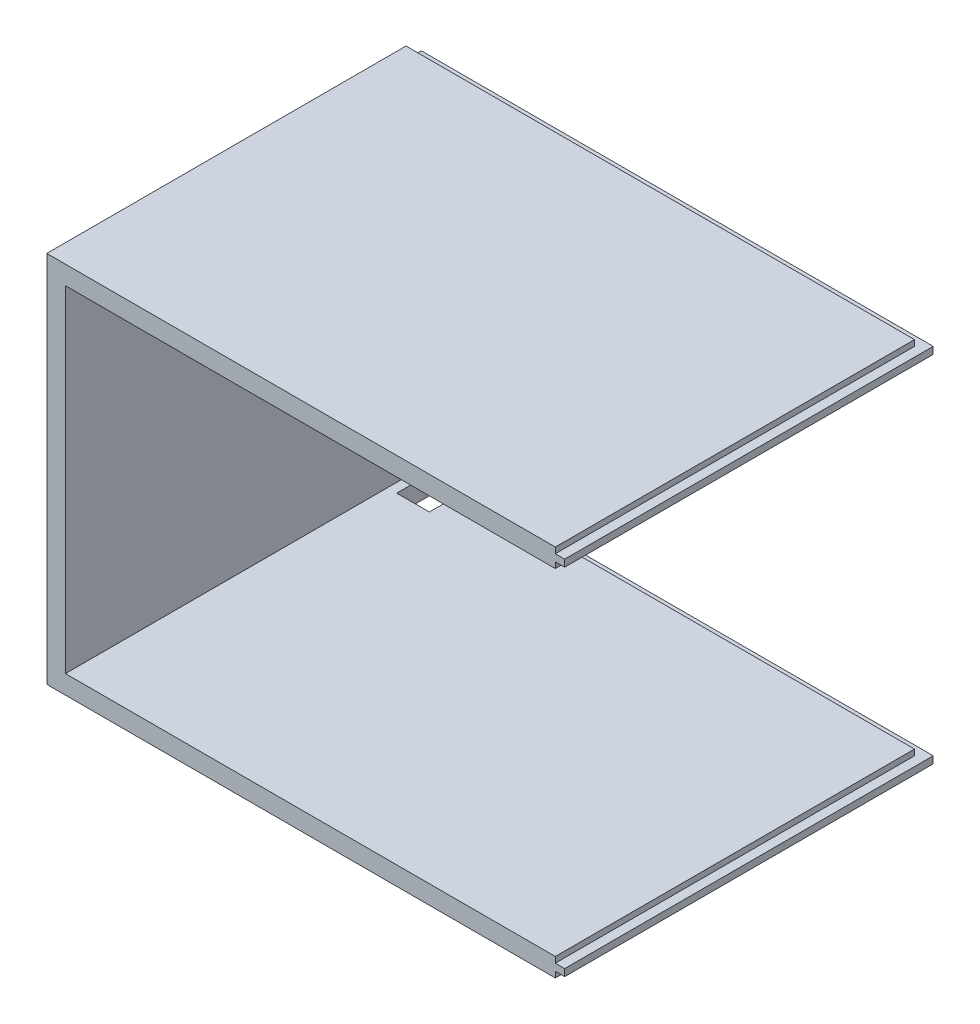
ISO-10303-21;
HEADER;
FILE_DESCRIPTION(('STEP AP214'),'2;1');
FILE_NAME('part.step','',(''),(''),'','','');
FILE_SCHEMA(('AUTOMOTIVE_DESIGN { 1 0 10303 214 1 1 1 1 }'));
ENDSEC;
DATA;
#1=APPLICATION_CONTEXT('core data for automotive mechanical design processes');
#2=APPLICATION_PROTOCOL_DEFINITION('international standard','automotive_design',2000,#1);
#3=PRODUCT_CONTEXT('',#1,'mechanical');
#4=PRODUCT('Part','Part','',(#3));
#5=PRODUCT_RELATED_PRODUCT_CATEGORY('part','',(#4));
#6=PRODUCT_DEFINITION_FORMATION('','',#4);
#7=PRODUCT_DEFINITION_CONTEXT('part definition',#1,'design');
#8=PRODUCT_DEFINITION('design','',#6,#7);
#9=PRODUCT_DEFINITION_SHAPE('','',#8);
#10=(LENGTH_UNIT() NAMED_UNIT(*) SI_UNIT(.MILLI.,.METRE.));
#11=(NAMED_UNIT(*) PLANE_ANGLE_UNIT() SI_UNIT($,.RADIAN.));
#12=(NAMED_UNIT(*) SI_UNIT($,.STERADIAN.) SOLID_ANGLE_UNIT());
#13=UNCERTAINTY_MEASURE_WITH_UNIT(LENGTH_MEASURE(1.E-05),#10,'distance_accuracy_value','');
#14=(GEOMETRIC_REPRESENTATION_CONTEXT(3) GLOBAL_UNCERTAINTY_ASSIGNED_CONTEXT((#13)) GLOBAL_UNIT_ASSIGNED_CONTEXT((#10,
#11,#12)) REPRESENTATION_CONTEXT('',''));
#15=CARTESIAN_POINT('',(0.,0.,0.));
#16=DIRECTION('',(0.,0.,1.));
#17=DIRECTION('',(1.,0.,0.));
#18=AXIS2_PLACEMENT_3D('',#15,#16,#17);
#19=CARTESIAN_POINT('',(0.,0.,-77.));
#20=DIRECTION('',(0.,0.,1.));
#21=DIRECTION('',(1.,0.,0.));
#22=AXIS2_PLACEMENT_3D('',#19,#20,#21);
#23=PLANE('',#22);
#24=DIRECTION('',(1.,0.,0.));
#25=VECTOR('',#24,1.);
#26=CARTESIAN_POINT('',(0.,-40.,-77.));
#27=LINE('',#26,#25);
#28=CARTESIAN_POINT('',(-42.5,-40.,-77.));
#29=VERTEX_POINT('',#28);
#30=CARTESIAN_POINT('',(53.5,-40.,-77.));
#31=VERTEX_POINT('',#30);
#32=EDGE_CURVE('E416',#29,#31,#27,.T.);
#33=ORIENTED_EDGE('',*,*,#32,.F.);
#34=DIRECTION('',(0.,1.,0.));
#35=VECTOR('',#34,1.);
#36=CARTESIAN_POINT('',(-42.5,0.,-77.));
#37=LINE('',#36,#35);
#38=CARTESIAN_POINT('',(-42.5,-38.75,-77.));
#39=VERTEX_POINT('',#38);
#40=EDGE_CURVE('E250',#29,#39,#37,.T.);
#41=ORIENTED_EDGE('',*,*,#40,.T.);
#42=DIRECTION('',(-1.,0.,0.));
#43=VECTOR('',#42,1.);
#44=CARTESIAN_POINT('',(0.,-38.75,-77.));
#45=LINE('',#44,#43);
#46=CARTESIAN_POINT('',(53.5,-38.75,-77.));
#47=VERTEX_POINT('',#46);
#48=EDGE_CURVE('E319',#47,#39,#45,.T.);
#49=ORIENTED_EDGE('',*,*,#48,.F.);
#50=DIRECTION('',(0.,1.,0.));
#51=VECTOR('',#50,1.);
#52=CARTESIAN_POINT('',(53.5,-38.75,-77.));
#53=LINE('',#52,#51);
#54=EDGE_CURVE('E361',#31,#47,#53,.T.);
#55=ORIENTED_EDGE('',*,*,#54,.F.);
#56=EDGE_LOOP('',(#33,#41,#49,#55));
#57=FACE_BOUND('',#56,.T.);
#58=ADVANCED_FACE('F41',(#57),#23,.F.);
#59=DIRECTION('',(-1.,0.,0.));
#60=VECTOR('',#59,1.);
#61=CARTESIAN_POINT('',(0.,-37.25,-77.));
#62=LINE('',#61,#60);
#63=CARTESIAN_POINT('',(53.5,-37.25,-77.));
#64=VERTEX_POINT('',#63);
#65=CARTESIAN_POINT('',(-42.5,-37.25,-77.));
#66=VERTEX_POINT('',#65);
#67=EDGE_CURVE('E258',#64,#66,#62,.T.);
#68=ORIENTED_EDGE('',*,*,#67,.T.);
#69=DIRECTION('',(0.,1.,0.));
#70=VECTOR('',#69,1.);
#71=CARTESIAN_POINT('',(-42.5,0.,-77.));
#72=LINE('',#71,#70);
#73=CARTESIAN_POINT('',(-42.5,-36.,-77.));
#74=VERTEX_POINT('',#73);
#75=EDGE_CURVE('E279',#66,#74,#72,.T.);
#76=ORIENTED_EDGE('',*,*,#75,.T.);
#77=DIRECTION('',(1.,0.,0.));
#78=VECTOR('',#77,1.);
#79=CARTESIAN_POINT('',(0.,-36.,-77.));
#80=LINE('',#79,#78);
#81=CARTESIAN_POINT('',(53.5,-36.,-77.));
#82=VERTEX_POINT('',#81);
#83=EDGE_CURVE('E407',#74,#82,#80,.T.);
#84=ORIENTED_EDGE('',*,*,#83,.T.);
#85=DIRECTION('',(0.,1.,0.));
#86=VECTOR('',#85,1.);
#87=CARTESIAN_POINT('',(53.5,-36.,-77.));
#88=LINE('',#87,#86);
#89=EDGE_CURVE('E368',#64,#82,#88,.T.);
#90=ORIENTED_EDGE('',*,*,#89,.F.);
#91=EDGE_LOOP('',(#68,#76,#84,#90));
#92=FACE_BOUND('',#91,.T.);
#93=ADVANCED_FACE('F465',(#92),#23,.F.);
#94=CARTESIAN_POINT('',(55.5,-37.25,0.));
#95=DIRECTION('',(0.,-1.,0.));
#96=DIRECTION('',(0.,0.,-1.));
#97=AXIS2_PLACEMENT_3D('',#94,#95,#96);
#98=PLANE('',#97);
#99=DIRECTION('',(-1.,0.,0.));
#100=VECTOR('',#99,1.);
#101=CARTESIAN_POINT('',(0.,-37.25,-79.));
#102=LINE('',#101,#100);
#103=CARTESIAN_POINT('',(55.5,-37.25,-79.));
#104=VERTEX_POINT('',#103);
#105=CARTESIAN_POINT('',(-42.5,-37.25,-79.));
#106=VERTEX_POINT('',#105);
#107=EDGE_CURVE('E300',#104,#106,#102,.T.);
#108=ORIENTED_EDGE('',*,*,#107,.T.);
#109=DIRECTION('',(0.,0.,1.));
#110=VECTOR('',#109,1.);
#111=CARTESIAN_POINT('',(-42.5,-37.25,0.));
#112=LINE('',#111,#110);
#113=EDGE_CURVE('E274',#106,#66,#112,.T.);
#114=ORIENTED_EDGE('',*,*,#113,.T.);
#115=ORIENTED_EDGE('',*,*,#67,.F.);
#116=DIRECTION('',(0.,0.,-1.));
#117=VECTOR('',#116,1.);
#118=CARTESIAN_POINT('',(53.5,-37.25,0.));
#119=LINE('',#118,#117);
#120=CARTESIAN_POINT('',(53.5,-37.25,0.));
#121=VERTEX_POINT('',#120);
#122=EDGE_CURVE('E395',#121,#64,#119,.T.);
#123=ORIENTED_EDGE('',*,*,#122,.F.);
#124=DIRECTION('',(-1.,0.,0.));
#125=VECTOR('',#124,1.);
#126=CARTESIAN_POINT('',(55.5,-37.25,0.));
#127=LINE('',#126,#125);
#128=CARTESIAN_POINT('',(55.5,-37.25,0.));
#129=VERTEX_POINT('',#128);
#130=EDGE_CURVE('E386',#129,#121,#127,.T.);
#131=ORIENTED_EDGE('',*,*,#130,.F.);
#132=DIRECTION('',(0.,0.,-1.));
#133=VECTOR('',#132,1.);
#134=CARTESIAN_POINT('',(55.5,-37.25,0.));
#135=LINE('',#134,#133);
#136=EDGE_CURVE('E396',#129,#104,#135,.T.);
#137=ORIENTED_EDGE('',*,*,#136,.T.);
#138=EDGE_LOOP('',(#108,#114,#115,#123,#131,#137));
#139=FACE_BOUND('',#138,.T.);
#140=ADVANCED_FACE('F462',(#139),#98,.F.);
#141=CARTESIAN_POINT('',(55.5,-38.75,0.));
#142=DIRECTION('',(0.,1.,0.));
#143=DIRECTION('',(0.,0.,1.));
#144=AXIS2_PLACEMENT_3D('',#141,#142,#143);
#145=PLANE('',#144);
#146=ORIENTED_EDGE('',*,*,#48,.T.);
#147=DIRECTION('',(0.,0.,-1.));
#148=VECTOR('',#147,1.);
#149=CARTESIAN_POINT('',(-42.5,-38.75,0.));
#150=LINE('',#149,#148);
#151=CARTESIAN_POINT('',(-42.5,-38.75,-79.));
#152=VERTEX_POINT('',#151);
#153=EDGE_CURVE('E271',#39,#152,#150,.T.);
#154=ORIENTED_EDGE('',*,*,#153,.T.);
#155=DIRECTION('',(-1.,0.,0.));
#156=VECTOR('',#155,1.);
#157=CARTESIAN_POINT('',(0.,-38.75,-79.));
#158=LINE('',#157,#156);
#159=CARTESIAN_POINT('',(55.5,-38.75,-79.));
#160=VERTEX_POINT('',#159);
#161=EDGE_CURVE('E307',#160,#152,#158,.T.);
#162=ORIENTED_EDGE('',*,*,#161,.F.);
#163=DIRECTION('',(0.,0.,-1.));
#164=VECTOR('',#163,1.);
#165=CARTESIAN_POINT('',(55.5,-38.75,0.));
#166=LINE('',#165,#164);
#167=CARTESIAN_POINT('',(55.5,-38.75,0.));
#168=VERTEX_POINT('',#167);
#169=EDGE_CURVE('E360',#168,#160,#166,.T.);
#170=ORIENTED_EDGE('',*,*,#169,.F.);
#171=DIRECTION('',(1.,0.,0.));
#172=VECTOR('',#171,1.);
#173=CARTESIAN_POINT('',(55.5,-38.75,0.));
#174=LINE('',#173,#172);
#175=CARTESIAN_POINT('',(53.5,-38.75,0.));
#176=VERTEX_POINT('',#175);
#177=EDGE_CURVE('E357',#176,#168,#174,.T.);
#178=ORIENTED_EDGE('',*,*,#177,.F.);
#179=DIRECTION('',(0.,0.,-1.));
#180=VECTOR('',#179,1.);
#181=CARTESIAN_POINT('',(53.5,-38.75,0.));
#182=LINE('',#181,#180);
#183=EDGE_CURVE('E354',#176,#47,#182,.T.);
#184=ORIENTED_EDGE('',*,*,#183,.T.);
#185=EDGE_LOOP('',(#146,#154,#162,#170,#178,#184));
#186=FACE_BOUND('',#185,.T.);
#187=ADVANCED_FACE('F474',(#186),#145,.F.);
#188=CARTESIAN_POINT('',(0.,0.,-79.));
#189=DIRECTION('',(0.,0.,-1.));
#190=DIRECTION('',(-1.,0.,0.));
#191=AXIS2_PLACEMENT_3D('',#188,#189,#190);
#192=PLANE('',#191);
#193=CARTESIAN_POINT('',(-49.5,-37.25,-79.));
#194=VERTEX_POINT('',#193);
#195=CARTESIAN_POINT('',(-52.75,-37.25,-79.));
#196=VERTEX_POINT('',#195);
#197=EDGE_CURVE('E298',#194,#196,#102,.T.);
#198=ORIENTED_EDGE('',*,*,#197,.F.);
#199=DIRECTION('',(0.,-1.,0.));
#200=VECTOR('',#199,1.);
#201=CARTESIAN_POINT('',(-49.5,-30.,-79.));
#202=LINE('',#201,#200);
#203=CARTESIAN_POINT('',(-49.5,-38.75,-79.));
#204=VERTEX_POINT('',#203);
#205=EDGE_CURVE('E11',#194,#204,#202,.T.);
#206=ORIENTED_EDGE('',*,*,#205,.T.);
#207=CARTESIAN_POINT('',(-54.25,-38.75,-79.));
#208=VERTEX_POINT('',#207);
#209=EDGE_CURVE('E308',#204,#208,#158,.T.);
#210=ORIENTED_EDGE('',*,*,#209,.T.);
#211=DIRECTION('',(0.,-1.,0.));
#212=VECTOR('',#211,1.);
#213=CARTESIAN_POINT('',(-54.25,0.,-79.));
#214=LINE('',#213,#212);
#215=CARTESIAN_POINT('',(-54.25,38.75,-79.));
#216=VERTEX_POINT('',#215);
#217=EDGE_CURVE('E283',#216,#208,#214,.T.);
#218=ORIENTED_EDGE('',*,*,#217,.F.);
#219=DIRECTION('',(-1.,0.,0.));
#220=VECTOR('',#219,1.);
#221=CARTESIAN_POINT('',(0.,38.75,-79.));
#222=LINE('',#221,#220);
#223=CARTESIAN_POINT('',(55.5,38.75,-79.));
#224=VERTEX_POINT('',#223);
#225=EDGE_CURVE('E290',#224,#216,#222,.T.);
#226=ORIENTED_EDGE('',*,*,#225,.F.);
#227=DIRECTION('',(0.,-1.,0.));
#228=VECTOR('',#227,1.);
#229=CARTESIAN_POINT('',(55.5,0.,-79.));
#230=LINE('',#229,#228);
#231=CARTESIAN_POINT('',(55.5,37.25,-79.));
#232=VERTEX_POINT('',#231);
#233=EDGE_CURVE('E292',#224,#232,#230,.T.);
#234=ORIENTED_EDGE('',*,*,#233,.T.);
#235=DIRECTION('',(-1.,0.,0.));
#236=VECTOR('',#235,1.);
#237=CARTESIAN_POINT('',(-1.29236898960271E-13,37.2499999999998,-79.));
#238=LINE('',#237,#236);
#239=CARTESIAN_POINT('',(-52.75,37.2499999999998,-79.));
#240=VERTEX_POINT('',#239);
#241=EDGE_CURVE('E294',#232,#240,#238,.T.);
#242=ORIENTED_EDGE('',*,*,#241,.T.);
#243=DIRECTION('',(0.,-1.,0.));
#244=VECTOR('',#243,1.);
#245=CARTESIAN_POINT('',(-52.75,0.,-79.));
#246=LINE('',#245,#244);
#247=EDGE_CURVE('E296',#240,#196,#246,.T.);
#248=ORIENTED_EDGE('',*,*,#247,.T.);
#249=EDGE_LOOP('',(#198,#206,#210,#218,#226,#234,#242,#248));
#250=FACE_BOUND('',#249,.T.);
#251=ADVANCED_FACE('F515',(#250),#192,.T.);
#252=CARTESIAN_POINT('',(-49.5,-38.75,-77.));
#253=VERTEX_POINT('',#252);
#254=CARTESIAN_POINT('',(-54.25,-38.75,-77.));
#255=VERTEX_POINT('',#254);
#256=EDGE_CURVE('E312',#253,#255,#45,.T.);
#257=ORIENTED_EDGE('',*,*,#256,.F.);
#258=DIRECTION('',(0.,-1.,0.));
#259=VECTOR('',#258,1.);
#260=CARTESIAN_POINT('',(-49.5,0.,-77.));
#261=LINE('',#260,#259);
#262=CARTESIAN_POINT('',(-49.5,-40.,-77.));
#263=VERTEX_POINT('',#262);
#264=EDGE_CURVE('E59',#253,#263,#261,.T.);
#265=ORIENTED_EDGE('',*,*,#264,.T.);
#266=CARTESIAN_POINT('',(-55.5,-40.,-77.));
#267=VERTEX_POINT('',#266);
#268=EDGE_CURVE('E420',#267,#263,#27,.T.);
#269=ORIENTED_EDGE('',*,*,#268,.F.);
#270=DIRECTION('',(0.,-1.,0.));
#271=VECTOR('',#270,1.);
#272=CARTESIAN_POINT('',(-55.5,0.,-77.));
#273=LINE('',#272,#271);
#274=CARTESIAN_POINT('',(-55.5,40.,-77.));
#275=VERTEX_POINT('',#274);
#276=EDGE_CURVE('E413',#275,#267,#273,.T.);
#277=ORIENTED_EDGE('',*,*,#276,.F.);
#278=DIRECTION('',(1.,0.,0.));
#279=VECTOR('',#278,1.);
#280=CARTESIAN_POINT('',(0.,40.,-77.));
#281=LINE('',#280,#279);
#282=CARTESIAN_POINT('',(53.5,40.,-77.));
#283=VERTEX_POINT('',#282);
#284=EDGE_CURVE('E415',#275,#283,#281,.T.);
#285=ORIENTED_EDGE('',*,*,#284,.T.);
#286=DIRECTION('',(0.,1.,0.));
#287=VECTOR('',#286,1.);
#288=CARTESIAN_POINT('',(53.5,40.,-77.));
#289=LINE('',#288,#287);
#290=CARTESIAN_POINT('',(53.5,38.75,-77.));
#291=VERTEX_POINT('',#290);
#292=EDGE_CURVE('E362',#291,#283,#289,.T.);
#293=ORIENTED_EDGE('',*,*,#292,.F.);
#294=DIRECTION('',(-1.,0.,0.));
#295=VECTOR('',#294,1.);
#296=CARTESIAN_POINT('',(0.,38.75,-77.));
#297=LINE('',#296,#295);
#298=CARTESIAN_POINT('',(-54.25,38.75,-77.));
#299=VERTEX_POINT('',#298);
#300=EDGE_CURVE('E315',#291,#299,#297,.T.);
#301=ORIENTED_EDGE('',*,*,#300,.T.);
#302=DIRECTION('',(0.,-1.,0.));
#303=VECTOR('',#302,1.);
#304=CARTESIAN_POINT('',(-54.25,0.,-77.));
#305=LINE('',#304,#303);
#306=EDGE_CURVE('E67',#299,#255,#305,.T.);
#307=ORIENTED_EDGE('',*,*,#306,.T.);
#308=EDGE_LOOP('',(#257,#265,#269,#277,#285,#293,#301,#307));
#309=FACE_BOUND('',#308,.T.);
#310=ADVANCED_FACE('F489',(#309),#23,.F.);
#311=CARTESIAN_POINT('',(55.5,0.,-77.));
#312=DIRECTION('',(-1.,0.,0.));
#313=DIRECTION('',(0.,-1.,0.));
#314=AXIS2_PLACEMENT_3D('',#311,#312,#313);
#315=PLANE('',#314);
#316=DIRECTION('',(0.,-1.,0.));
#317=VECTOR('',#316,1.);
#318=CARTESIAN_POINT('',(55.5,0.,0.));
#319=LINE('',#318,#317);
#320=EDGE_CURVE('E427',#129,#168,#319,.T.);
#321=ORIENTED_EDGE('',*,*,#320,.T.);
#322=ORIENTED_EDGE('',*,*,#169,.T.);
#323=DIRECTION('',(0.,-1.,0.));
#324=VECTOR('',#323,1.);
#325=CARTESIAN_POINT('',(55.5,0.,-79.));
#326=LINE('',#325,#324);
#327=EDGE_CURVE('E304',#104,#160,#326,.T.);
#328=ORIENTED_EDGE('',*,*,#327,.F.);
#329=ORIENTED_EDGE('',*,*,#136,.F.);
#330=EDGE_LOOP('',(#321,#322,#328,#329));
#331=FACE_BOUND('',#330,.T.);
#332=ADVANCED_FACE('F471',(#331),#315,.F.);
#333=DIRECTION('',(0.,0.,-1.));
#334=VECTOR('',#333,1.);
#335=CARTESIAN_POINT('',(55.5,38.75,0.));
#336=LINE('',#335,#334);
#337=CARTESIAN_POINT('',(55.5,38.75,0.));
#338=VERTEX_POINT('',#337);
#339=EDGE_CURVE('E376',#338,#224,#336,.T.);
#340=ORIENTED_EDGE('',*,*,#339,.F.);
#341=CARTESIAN_POINT('',(55.5,37.25,0.));
#342=VERTEX_POINT('',#341);
#343=EDGE_CURVE('E428',#338,#342,#319,.T.);
#344=ORIENTED_EDGE('',*,*,#343,.T.);
#345=DIRECTION('',(0.,0.,-1.));
#346=VECTOR('',#345,1.);
#347=CARTESIAN_POINT('',(55.5,37.25,0.));
#348=LINE('',#347,#346);
#349=EDGE_CURVE('E342',#342,#232,#348,.T.);
#350=ORIENTED_EDGE('',*,*,#349,.T.);
#351=ORIENTED_EDGE('',*,*,#233,.F.);
#352=EDGE_LOOP('',(#340,#344,#350,#351));
#353=FACE_BOUND('',#352,.T.);
#354=ADVANCED_FACE('F507',(#353),#315,.F.);
#355=CARTESIAN_POINT('',(-51.5,-36.,-77.));
#356=VERTEX_POINT('',#355);
#357=CARTESIAN_POINT('',(-49.5,-36.,-77.));
#358=VERTEX_POINT('',#357);
#359=EDGE_CURVE('E401',#356,#358,#80,.T.);
#360=ORIENTED_EDGE('',*,*,#359,.T.);
#361=DIRECTION('',(0.,-1.,0.));
#362=VECTOR('',#361,1.);
#363=CARTESIAN_POINT('',(-49.5,0.,-77.));
#364=LINE('',#363,#362);
#365=CARTESIAN_POINT('',(-49.5,-37.25,-77.));
#366=VERTEX_POINT('',#365);
#367=EDGE_CURVE('E264',#358,#366,#364,.T.);
#368=ORIENTED_EDGE('',*,*,#367,.T.);
#369=CARTESIAN_POINT('',(-52.75,-37.25,-77.));
#370=VERTEX_POINT('',#369);
#371=EDGE_CURVE('E317',#366,#370,#62,.T.);
#372=ORIENTED_EDGE('',*,*,#371,.T.);
#373=DIRECTION('',(0.,-1.,0.));
#374=VECTOR('',#373,1.);
#375=CARTESIAN_POINT('',(-52.75,0.,-77.));
#376=LINE('',#375,#374);
#377=CARTESIAN_POINT('',(-52.75,37.2499999999998,-77.));
#378=VERTEX_POINT('',#377);
#379=EDGE_CURVE('E289',#378,#370,#376,.T.);
#380=ORIENTED_EDGE('',*,*,#379,.F.);
#381=DIRECTION('',(-1.,0.,0.));
#382=VECTOR('',#381,1.);
#383=CARTESIAN_POINT('',(-1.29236898960271E-13,37.2499999999998,-77.));
#384=LINE('',#383,#382);
#385=CARTESIAN_POINT('',(53.5,37.25,-77.));
#386=VERTEX_POINT('',#385);
#387=EDGE_CURVE('E320',#386,#378,#384,.T.);
#388=ORIENTED_EDGE('',*,*,#387,.F.);
#389=DIRECTION('',(0.,1.,0.));
#390=VECTOR('',#389,1.);
#391=CARTESIAN_POINT('',(53.5,37.25,-77.));
#392=LINE('',#391,#390);
#393=CARTESIAN_POINT('',(53.5,36.,-77.));
#394=VERTEX_POINT('',#393);
#395=EDGE_CURVE('E341',#394,#386,#392,.T.);
#396=ORIENTED_EDGE('',*,*,#395,.F.);
#397=DIRECTION('',(1.,0.,0.));
#398=VECTOR('',#397,1.);
#399=CARTESIAN_POINT('',(0.,36.,-77.));
#400=LINE('',#399,#398);
#401=CARTESIAN_POINT('',(-51.5,36.,-77.));
#402=VERTEX_POINT('',#401);
#403=EDGE_CURVE('E408',#402,#394,#400,.T.);
#404=ORIENTED_EDGE('',*,*,#403,.F.);
#405=DIRECTION('',(0.,-1.,0.));
#406=VECTOR('',#405,1.);
#407=CARTESIAN_POINT('',(-51.5,0.,-77.));
#408=LINE('',#407,#406);
#409=EDGE_CURVE('E406',#402,#356,#408,.T.);
#410=ORIENTED_EDGE('',*,*,#409,.T.);
#411=EDGE_LOOP('',(#360,#368,#372,#380,#388,#396,#404,#410));
#412=FACE_BOUND('',#411,.T.);
#413=ADVANCED_FACE('F528',(#412),#23,.F.);
#414=CARTESIAN_POINT('',(0.,0.,0.));
#415=DIRECTION('',(0.,0.,1.));
#416=DIRECTION('',(1.,0.,0.));
#417=AXIS2_PLACEMENT_3D('',#414,#415,#416);
#418=PLANE('',#417);
#419=DIRECTION('',(1.,0.,0.));
#420=VECTOR('',#419,1.);
#421=CARTESIAN_POINT('',(0.,-40.,0.));
#422=LINE('',#421,#420);
#423=CARTESIAN_POINT('',(-55.5,-40.,0.));
#424=VERTEX_POINT('',#423);
#425=CARTESIAN_POINT('',(53.5,-40.,0.));
#426=VERTEX_POINT('',#425);
#427=EDGE_CURVE('E435',#424,#426,#422,.T.);
#428=ORIENTED_EDGE('',*,*,#427,.T.);
#429=DIRECTION('',(0.,1.,0.));
#430=VECTOR('',#429,1.);
#431=CARTESIAN_POINT('',(53.5,-38.75,0.));
#432=LINE('',#431,#430);
#433=EDGE_CURVE('E370',#426,#176,#432,.T.);
#434=ORIENTED_EDGE('',*,*,#433,.T.);
#435=ORIENTED_EDGE('',*,*,#177,.T.);
#436=ORIENTED_EDGE('',*,*,#320,.F.);
#437=ORIENTED_EDGE('',*,*,#130,.T.);
#438=DIRECTION('',(0.,1.,0.));
#439=VECTOR('',#438,1.);
#440=CARTESIAN_POINT('',(53.5,-36.,0.));
#441=LINE('',#440,#439);
#442=CARTESIAN_POINT('',(53.5,-36.,0.));
#443=VERTEX_POINT('',#442);
#444=EDGE_CURVE('E387',#121,#443,#441,.T.);
#445=ORIENTED_EDGE('',*,*,#444,.T.);
#446=DIRECTION('',(1.,0.,0.));
#447=VECTOR('',#446,1.);
#448=CARTESIAN_POINT('',(0.,-36.,0.));
#449=LINE('',#448,#447);
#450=CARTESIAN_POINT('',(-51.5,-36.,0.));
#451=VERTEX_POINT('',#450);
#452=EDGE_CURVE('E399',#451,#443,#449,.T.);
#453=ORIENTED_EDGE('',*,*,#452,.F.);
#454=DIRECTION('',(0.,-1.,0.));
#455=VECTOR('',#454,1.);
#456=CARTESIAN_POINT('',(-51.5,0.,0.));
#457=LINE('',#456,#455);
#458=CARTESIAN_POINT('',(-51.5,36.,0.));
#459=VERTEX_POINT('',#458);
#460=EDGE_CURVE('E421',#459,#451,#457,.T.);
#461=ORIENTED_EDGE('',*,*,#460,.F.);
#462=DIRECTION('',(1.,0.,0.));
#463=VECTOR('',#462,1.);
#464=CARTESIAN_POINT('',(0.,36.,0.));
#465=LINE('',#464,#463);
#466=CARTESIAN_POINT('',(53.5,36.,0.));
#467=VERTEX_POINT('',#466);
#468=EDGE_CURVE('E422',#459,#467,#465,.T.);
#469=ORIENTED_EDGE('',*,*,#468,.T.);
#470=DIRECTION('',(0.,1.,0.));
#471=VECTOR('',#470,1.);
#472=CARTESIAN_POINT('',(53.5,37.25,0.));
#473=LINE('',#472,#471);
#474=CARTESIAN_POINT('',(53.5,37.25,0.));
#475=VERTEX_POINT('',#474);
#476=EDGE_CURVE('E346',#467,#475,#473,.T.);
#477=ORIENTED_EDGE('',*,*,#476,.T.);
#478=DIRECTION('',(1.,0.,0.));
#479=VECTOR('',#478,1.);
#480=CARTESIAN_POINT('',(55.5,37.25,0.));
#481=LINE('',#480,#479);
#482=EDGE_CURVE('E340',#475,#342,#481,.T.);
#483=ORIENTED_EDGE('',*,*,#482,.T.);
#484=ORIENTED_EDGE('',*,*,#343,.F.);
#485=DIRECTION('',(-1.,0.,0.));
#486=VECTOR('',#485,1.);
#487=CARTESIAN_POINT('',(55.5,38.75,0.));
#488=LINE('',#487,#486);
#489=CARTESIAN_POINT('',(53.5,38.75,0.));
#490=VERTEX_POINT('',#489);
#491=EDGE_CURVE('E374',#338,#490,#488,.T.);
#492=ORIENTED_EDGE('',*,*,#491,.T.);
#493=DIRECTION('',(0.,1.,0.));
#494=VECTOR('',#493,1.);
#495=CARTESIAN_POINT('',(53.5,40.,0.));
#496=LINE('',#495,#494);
#497=CARTESIAN_POINT('',(53.5,40.,0.));
#498=VERTEX_POINT('',#497);
#499=EDGE_CURVE('E381',#490,#498,#496,.T.);
#500=ORIENTED_EDGE('',*,*,#499,.T.);
#501=DIRECTION('',(1.,0.,0.));
#502=VECTOR('',#501,1.);
#503=CARTESIAN_POINT('',(0.,40.,0.));
#504=LINE('',#503,#502);
#505=CARTESIAN_POINT('',(-55.5,40.,0.));
#506=VERTEX_POINT('',#505);
#507=EDGE_CURVE('E433',#506,#498,#504,.T.);
#508=ORIENTED_EDGE('',*,*,#507,.F.);
#509=DIRECTION('',(0.,-1.,0.));
#510=VECTOR('',#509,1.);
#511=CARTESIAN_POINT('',(-55.5,0.,0.));
#512=LINE('',#511,#510);
#513=EDGE_CURVE('E436',#506,#424,#512,.T.);
#514=ORIENTED_EDGE('',*,*,#513,.T.);
#515=EDGE_LOOP('',(#428,#434,#435,#436,#437,#445,#453,#461,#469,#477,#483,#484,#492,#500,#508,#514));
#516=FACE_BOUND('',#515,.T.);
#517=ADVANCED_FACE('F451',(#516),#418,.T.);
#518=CARTESIAN_POINT('',(0.,-36.,-77.));
#519=DIRECTION('',(0.,-1.,0.));
#520=DIRECTION('',(0.,0.,-1.));
#521=AXIS2_PLACEMENT_3D('',#518,#519,#520);
#522=PLANE('',#521);
#523=ORIENTED_EDGE('',*,*,#83,.F.);
#524=DIRECTION('',(0.,0.,1.));
#525=VECTOR('',#524,1.);
#526=CARTESIAN_POINT('',(-42.5,-36.,-77.));
#527=LINE('',#526,#525);
#528=CARTESIAN_POINT('',(-42.5,-36.,-69.));
#529=VERTEX_POINT('',#528);
#530=EDGE_CURVE('E281',#74,#529,#527,.T.);
#531=ORIENTED_EDGE('',*,*,#530,.T.);
#532=DIRECTION('',(-1.,0.,0.));
#533=VECTOR('',#532,1.);
#534=CARTESIAN_POINT('',(0.,-36.,-69.));
#535=LINE('',#534,#533);
#536=CARTESIAN_POINT('',(-49.5,-36.,-69.));
#537=VERTEX_POINT('',#536);
#538=EDGE_CURVE('E240',#529,#537,#535,.T.);
#539=ORIENTED_EDGE('',*,*,#538,.T.);
#540=DIRECTION('',(0.,0.,-1.));
#541=VECTOR('',#540,1.);
#542=CARTESIAN_POINT('',(-49.5,-36.,-77.));
#543=LINE('',#542,#541);
#544=EDGE_CURVE('E268',#537,#358,#543,.T.);
#545=ORIENTED_EDGE('',*,*,#544,.T.);
#546=ORIENTED_EDGE('',*,*,#359,.F.);
#547=DIRECTION('',(0.,0.,1.));
#548=VECTOR('',#547,1.);
#549=CARTESIAN_POINT('',(-51.5,-36.,-77.));
#550=LINE('',#549,#548);
#551=EDGE_CURVE('E44',#356,#451,#550,.T.);
#552=ORIENTED_EDGE('',*,*,#551,.T.);
#553=ORIENTED_EDGE('',*,*,#452,.T.);
#554=DIRECTION('',(0.,0.,-1.));
#555=VECTOR('',#554,1.);
#556=CARTESIAN_POINT('',(53.5,-36.,0.));
#557=LINE('',#556,#555);
#558=EDGE_CURVE('E392',#443,#82,#557,.T.);
#559=ORIENTED_EDGE('',*,*,#558,.T.);
#560=EDGE_LOOP('',(#523,#531,#539,#545,#546,#552,#553,#559));
#561=FACE_BOUND('',#560,.T.);
#562=ADVANCED_FACE('F43',(#561),#522,.F.);
#563=CARTESIAN_POINT('',(0.,-40.,-77.));
#564=DIRECTION('',(0.,-1.,0.));
#565=DIRECTION('',(0.,0.,-1.));
#566=AXIS2_PLACEMENT_3D('',#563,#564,#565);
#567=PLANE('',#566);
#568=DIRECTION('',(0.,0.,1.));
#569=VECTOR('',#568,1.);
#570=CARTESIAN_POINT('',(-42.5,-40.,-69.));
#571=LINE('',#570,#569);
#572=CARTESIAN_POINT('',(-42.5,-40.,-69.));
#573=VERTEX_POINT('',#572);
#574=EDGE_CURVE('E243',#29,#573,#571,.T.);
#575=ORIENTED_EDGE('',*,*,#574,.F.);
#576=ORIENTED_EDGE('',*,*,#32,.T.);
#577=DIRECTION('',(0.,0.,-1.));
#578=VECTOR('',#577,1.);
#579=CARTESIAN_POINT('',(53.5,-40.,0.));
#580=LINE('',#579,#578);
#581=EDGE_CURVE('E356',#426,#31,#580,.T.);
#582=ORIENTED_EDGE('',*,*,#581,.F.);
#583=ORIENTED_EDGE('',*,*,#427,.F.);
#584=DIRECTION('',(0.,0.,1.));
#585=VECTOR('',#584,1.);
#586=CARTESIAN_POINT('',(-55.5,-40.,-77.));
#587=LINE('',#586,#585);
#588=EDGE_CURVE('E316',#267,#424,#587,.T.);
#589=ORIENTED_EDGE('',*,*,#588,.F.);
#590=ORIENTED_EDGE('',*,*,#268,.T.);
#591=DIRECTION('',(0.,0.,-1.));
#592=VECTOR('',#591,1.);
#593=CARTESIAN_POINT('',(-49.5,-40.,-69.));
#594=LINE('',#593,#592);
#595=CARTESIAN_POINT('',(-49.5,-40.,-69.));
#596=VERTEX_POINT('',#595);
#597=EDGE_CURVE('E241',#596,#263,#594,.T.);
#598=ORIENTED_EDGE('',*,*,#597,.F.);
#599=DIRECTION('',(-1.,0.,0.));
#600=VECTOR('',#599,1.);
#601=CARTESIAN_POINT('',(-49.5,-40.,-69.));
#602=LINE('',#601,#600);
#603=EDGE_CURVE('E231',#573,#596,#602,.T.);
#604=ORIENTED_EDGE('',*,*,#603,.F.);
#605=EDGE_LOOP('',(#575,#576,#582,#583,#589,#590,#598,#604));
#606=FACE_BOUND('',#605,.T.);
#607=ADVANCED_FACE('F253',(#606),#567,.T.);
#608=CARTESIAN_POINT('',(-55.5,0.,-77.));
#609=DIRECTION('',(-1.,0.,0.));
#610=DIRECTION('',(0.,0.,1.));
#611=AXIS2_PLACEMENT_3D('',#608,#609,#610);
#612=PLANE('',#611);
#613=ORIENTED_EDGE('',*,*,#513,.F.);
#614=DIRECTION('',(0.,0.,1.));
#615=VECTOR('',#614,1.);
#616=CARTESIAN_POINT('',(-55.5,40.,-77.));
#617=LINE('',#616,#615);
#618=EDGE_CURVE('E445',#275,#506,#617,.T.);
#619=ORIENTED_EDGE('',*,*,#618,.F.);
#620=ORIENTED_EDGE('',*,*,#276,.T.);
#621=ORIENTED_EDGE('',*,*,#588,.T.);
#622=EDGE_LOOP('',(#613,#619,#620,#621));
#623=FACE_BOUND('',#622,.T.);
#624=ADVANCED_FACE('F491',(#623),#612,.T.);
#625=CARTESIAN_POINT('',(0.,40.,-77.));
#626=DIRECTION('',(0.,-1.,0.));
#627=DIRECTION('',(0.,0.,-1.));
#628=AXIS2_PLACEMENT_3D('',#625,#626,#627);
#629=PLANE('',#628);
#630=ORIENTED_EDGE('',*,*,#507,.T.);
#631=DIRECTION('',(0.,0.,-1.));
#632=VECTOR('',#631,1.);
#633=CARTESIAN_POINT('',(53.5,40.,0.));
#634=LINE('',#633,#632);
#635=EDGE_CURVE('E375',#498,#283,#634,.T.);
#636=ORIENTED_EDGE('',*,*,#635,.T.);
#637=ORIENTED_EDGE('',*,*,#284,.F.);
#638=ORIENTED_EDGE('',*,*,#618,.T.);
#639=EDGE_LOOP('',(#630,#636,#637,#638));
#640=FACE_BOUND('',#639,.T.);
#641=ADVANCED_FACE('F493',(#640),#629,.F.);
#642=CARTESIAN_POINT('',(0.,36.,-77.));
#643=DIRECTION('',(0.,-1.,0.));
#644=DIRECTION('',(0.,0.,-1.));
#645=AXIS2_PLACEMENT_3D('',#642,#643,#644);
#646=PLANE('',#645);
#647=DIRECTION('',(0.,0.,-1.));
#648=VECTOR('',#647,1.);
#649=CARTESIAN_POINT('',(53.5,36.,0.));
#650=LINE('',#649,#648);
#651=EDGE_CURVE('E336',#467,#394,#650,.T.);
#652=ORIENTED_EDGE('',*,*,#651,.F.);
#653=ORIENTED_EDGE('',*,*,#468,.F.);
#654=DIRECTION('',(0.,0.,1.));
#655=VECTOR('',#654,1.);
#656=CARTESIAN_POINT('',(-51.5,36.,-77.));
#657=LINE('',#656,#655);
#658=EDGE_CURVE('E444',#402,#459,#657,.T.);
#659=ORIENTED_EDGE('',*,*,#658,.F.);
#660=ORIENTED_EDGE('',*,*,#403,.T.);
#661=EDGE_LOOP('',(#652,#653,#659,#660));
#662=FACE_BOUND('',#661,.T.);
#663=ADVANCED_FACE('F535',(#662),#646,.T.);
#664=CARTESIAN_POINT('',(-51.5,0.,-77.));
#665=DIRECTION('',(-1.,0.,0.));
#666=DIRECTION('',(0.,-1.,0.));
#667=AXIS2_PLACEMENT_3D('',#664,#665,#666);
#668=PLANE('',#667);
#669=ORIENTED_EDGE('',*,*,#460,.T.);
#670=ORIENTED_EDGE('',*,*,#551,.F.);
#671=ORIENTED_EDGE('',*,*,#409,.F.);
#672=ORIENTED_EDGE('',*,*,#658,.T.);
#673=EDGE_LOOP('',(#669,#670,#671,#672));
#674=FACE_BOUND('',#673,.T.);
#675=ADVANCED_FACE('F529',(#674),#668,.F.);
#676=CARTESIAN_POINT('',(53.5,-36.,0.));
#677=DIRECTION('',(-1.,0.,0.));
#678=DIRECTION('',(0.,0.,1.));
#679=AXIS2_PLACEMENT_3D('',#676,#677,#678);
#680=PLANE('',#679);
#681=ORIENTED_EDGE('',*,*,#89,.T.);
#682=ORIENTED_EDGE('',*,*,#558,.F.);
#683=ORIENTED_EDGE('',*,*,#444,.F.);
#684=ORIENTED_EDGE('',*,*,#122,.T.);
#685=EDGE_LOOP('',(#681,#682,#683,#684));
#686=FACE_BOUND('',#685,.T.);
#687=ADVANCED_FACE('F459',(#686),#680,.F.);
#688=ORIENTED_EDGE('',*,*,#371,.F.);
#689=DIRECTION('',(0.,0.,-1.));
#690=VECTOR('',#689,1.);
#691=CARTESIAN_POINT('',(-49.5,-37.25,0.));
#692=LINE('',#691,#690);
#693=EDGE_CURVE('E265',#366,#194,#692,.T.);
#694=ORIENTED_EDGE('',*,*,#693,.T.);
#695=ORIENTED_EDGE('',*,*,#197,.T.);
#696=DIRECTION('',(0.,0.,1.));
#697=VECTOR('',#696,1.);
#698=CARTESIAN_POINT('',(-52.75,-37.25,-79.));
#699=LINE('',#698,#697);
#700=EDGE_CURVE('E327',#196,#370,#699,.T.);
#701=ORIENTED_EDGE('',*,*,#700,.T.);
#702=EDGE_LOOP('',(#688,#694,#695,#701));
#703=FACE_BOUND('',#702,.T.);
#704=ADVANCED_FACE('F521',(#703),#98,.F.);
#705=CARTESIAN_POINT('',(53.5,37.25,0.));
#706=DIRECTION('',(-1.,0.,0.));
#707=DIRECTION('',(0.,0.,1.));
#708=AXIS2_PLACEMENT_3D('',#705,#706,#707);
#709=PLANE('',#708);
#710=ORIENTED_EDGE('',*,*,#395,.T.);
#711=DIRECTION('',(0.,0.,-1.));
#712=VECTOR('',#711,1.);
#713=CARTESIAN_POINT('',(53.5,37.25,0.));
#714=LINE('',#713,#712);
#715=EDGE_CURVE('E337',#475,#386,#714,.T.);
#716=ORIENTED_EDGE('',*,*,#715,.F.);
#717=ORIENTED_EDGE('',*,*,#476,.F.);
#718=ORIENTED_EDGE('',*,*,#651,.T.);
#719=EDGE_LOOP('',(#710,#716,#717,#718));
#720=FACE_BOUND('',#719,.T.);
#721=ADVANCED_FACE('F578',(#720),#709,.F.);
#722=CARTESIAN_POINT('',(55.5,37.25,0.));
#723=DIRECTION('',(0.,1.,0.));
#724=DIRECTION('',(-1.,0.,0.));
#725=AXIS2_PLACEMENT_3D('',#722,#723,#724);
#726=PLANE('',#725);
#727=ORIENTED_EDGE('',*,*,#715,.T.);
#728=ORIENTED_EDGE('',*,*,#387,.T.);
#729=DIRECTION('',(0.,0.,1.));
#730=VECTOR('',#729,1.);
#731=CARTESIAN_POINT('',(-52.75,37.2499999999998,-79.));
#732=LINE('',#731,#730);
#733=EDGE_CURVE('E332',#240,#378,#732,.T.);
#734=ORIENTED_EDGE('',*,*,#733,.F.);
#735=ORIENTED_EDGE('',*,*,#241,.F.);
#736=ORIENTED_EDGE('',*,*,#349,.F.);
#737=ORIENTED_EDGE('',*,*,#482,.F.);
#738=EDGE_LOOP('',(#727,#728,#734,#735,#736,#737));
#739=FACE_BOUND('',#738,.T.);
#740=ADVANCED_FACE('F581',(#739),#726,.F.);
#741=CARTESIAN_POINT('',(53.5,40.,0.));
#742=DIRECTION('',(-1.,0.,0.));
#743=DIRECTION('',(0.,0.,1.));
#744=AXIS2_PLACEMENT_3D('',#741,#742,#743);
#745=PLANE('',#744);
#746=ORIENTED_EDGE('',*,*,#292,.T.);
#747=ORIENTED_EDGE('',*,*,#635,.F.);
#748=ORIENTED_EDGE('',*,*,#499,.F.);
#749=DIRECTION('',(0.,0.,-1.));
#750=VECTOR('',#749,1.);
#751=CARTESIAN_POINT('',(53.5,38.75,0.));
#752=LINE('',#751,#750);
#753=EDGE_CURVE('E350',#490,#291,#752,.T.);
#754=ORIENTED_EDGE('',*,*,#753,.T.);
#755=EDGE_LOOP('',(#746,#747,#748,#754));
#756=FACE_BOUND('',#755,.T.);
#757=ADVANCED_FACE('F500',(#756),#745,.F.);
#758=CARTESIAN_POINT('',(55.5,38.75,0.));
#759=DIRECTION('',(0.,-1.,0.));
#760=DIRECTION('',(0.,0.,-1.));
#761=AXIS2_PLACEMENT_3D('',#758,#759,#760);
#762=PLANE('',#761);
#763=ORIENTED_EDGE('',*,*,#339,.T.);
#764=ORIENTED_EDGE('',*,*,#225,.T.);
#765=DIRECTION('',(0.,0.,1.));
#766=VECTOR('',#765,1.);
#767=CARTESIAN_POINT('',(-54.25,38.75,-79.));
#768=LINE('',#767,#766);
#769=EDGE_CURVE('E331',#216,#299,#768,.T.);
#770=ORIENTED_EDGE('',*,*,#769,.T.);
#771=ORIENTED_EDGE('',*,*,#300,.F.);
#772=ORIENTED_EDGE('',*,*,#753,.F.);
#773=ORIENTED_EDGE('',*,*,#491,.F.);
#774=EDGE_LOOP('',(#763,#764,#770,#771,#772,#773));
#775=FACE_BOUND('',#774,.T.);
#776=ADVANCED_FACE('F498',(#775),#762,.F.);
#777=CARTESIAN_POINT('',(53.5,-38.75,0.));
#778=DIRECTION('',(-1.,0.,0.));
#779=DIRECTION('',(0.,0.,1.));
#780=AXIS2_PLACEMENT_3D('',#777,#778,#779);
#781=PLANE('',#780);
#782=ORIENTED_EDGE('',*,*,#54,.T.);
#783=ORIENTED_EDGE('',*,*,#183,.F.);
#784=ORIENTED_EDGE('',*,*,#433,.F.);
#785=ORIENTED_EDGE('',*,*,#581,.T.);
#786=EDGE_LOOP('',(#782,#783,#784,#785));
#787=FACE_BOUND('',#786,.T.);
#788=ADVANCED_FACE('F485',(#787),#781,.F.);
#789=ORIENTED_EDGE('',*,*,#209,.F.);
#790=DIRECTION('',(0.,0.,1.));
#791=VECTOR('',#790,1.);
#792=CARTESIAN_POINT('',(-49.5,-38.75,0.));
#793=LINE('',#792,#791);
#794=EDGE_CURVE('E256',#204,#253,#793,.T.);
#795=ORIENTED_EDGE('',*,*,#794,.T.);
#796=ORIENTED_EDGE('',*,*,#256,.T.);
#797=DIRECTION('',(0.,0.,1.));
#798=VECTOR('',#797,1.);
#799=CARTESIAN_POINT('',(-54.25,-38.75,-79.));
#800=LINE('',#799,#798);
#801=EDGE_CURVE('E309',#208,#255,#800,.T.);
#802=ORIENTED_EDGE('',*,*,#801,.F.);
#803=EDGE_LOOP('',(#789,#795,#796,#802));
#804=FACE_BOUND('',#803,.T.);
#805=ADVANCED_FACE('F519',(#804),#145,.F.);
#806=CARTESIAN_POINT('',(-54.25,0.,-79.));
#807=DIRECTION('',(-1.,0.,0.));
#808=DIRECTION('',(0.,0.,1.));
#809=AXIS2_PLACEMENT_3D('',#806,#807,#808);
#810=PLANE('',#809);
#811=ORIENTED_EDGE('',*,*,#306,.F.);
#812=ORIENTED_EDGE('',*,*,#769,.F.);
#813=ORIENTED_EDGE('',*,*,#217,.T.);
#814=ORIENTED_EDGE('',*,*,#801,.T.);
#815=EDGE_LOOP('',(#811,#812,#813,#814));
#816=FACE_BOUND('',#815,.T.);
#817=ADVANCED_FACE('F516',(#816),#810,.T.);
#818=CARTESIAN_POINT('',(-52.75,0.,-79.));
#819=DIRECTION('',(-1.,0.,0.));
#820=DIRECTION('',(0.,-1.,0.));
#821=AXIS2_PLACEMENT_3D('',#818,#819,#820);
#822=PLANE('',#821);
#823=ORIENTED_EDGE('',*,*,#379,.T.);
#824=ORIENTED_EDGE('',*,*,#700,.F.);
#825=ORIENTED_EDGE('',*,*,#247,.F.);
#826=ORIENTED_EDGE('',*,*,#733,.T.);
#827=EDGE_LOOP('',(#823,#824,#825,#826));
#828=FACE_BOUND('',#827,.T.);
#829=ADVANCED_FACE('F566',(#828),#822,.F.);
#830=DIRECTION('',(0.,-1.,0.));
#831=VECTOR('',#830,1.);
#832=CARTESIAN_POINT('',(-42.5,-30.,-79.));
#833=LINE('',#832,#831);
#834=EDGE_CURVE('E49',#106,#152,#833,.T.);
#835=ORIENTED_EDGE('',*,*,#834,.F.);
#836=ORIENTED_EDGE('',*,*,#107,.F.);
#837=ORIENTED_EDGE('',*,*,#327,.T.);
#838=ORIENTED_EDGE('',*,*,#161,.T.);
#839=EDGE_LOOP('',(#835,#836,#837,#838));
#840=FACE_BOUND('',#839,.T.);
#841=ADVANCED_FACE('F466',(#840),#192,.T.);
#842=CARTESIAN_POINT('',(-49.5,-30.,-69.));
#843=DIRECTION('',(0.,0.,1.));
#844=DIRECTION('',(1.,0.,0.));
#845=AXIS2_PLACEMENT_3D('',#842,#843,#844);
#846=PLANE('',#845);
#847=DIRECTION('',(0.,-1.,0.));
#848=VECTOR('',#847,1.);
#849=CARTESIAN_POINT('',(-42.5,-30.,-69.));
#850=LINE('',#849,#848);
#851=EDGE_CURVE('E228',#529,#573,#850,.T.);
#852=ORIENTED_EDGE('',*,*,#851,.T.);
#853=ORIENTED_EDGE('',*,*,#603,.T.);
#854=DIRECTION('',(0.,-1.,0.));
#855=VECTOR('',#854,1.);
#856=CARTESIAN_POINT('',(-49.5,-30.,-69.));
#857=LINE('',#856,#855);
#858=EDGE_CURVE('E238',#537,#596,#857,.T.);
#859=ORIENTED_EDGE('',*,*,#858,.F.);
#860=ORIENTED_EDGE('',*,*,#538,.F.);
#861=EDGE_LOOP('',(#852,#853,#859,#860));
#862=FACE_BOUND('',#861,.T.);
#863=ADVANCED_FACE('F232',(#862),#846,.F.);
#864=CARTESIAN_POINT('',(-42.5,-30.,-69.));
#865=DIRECTION('',(1.,0.,0.));
#866=DIRECTION('',(0.,0.,-1.));
#867=AXIS2_PLACEMENT_3D('',#864,#865,#866);
#868=PLANE('',#867);
#869=ORIENTED_EDGE('',*,*,#75,.F.);
#870=ORIENTED_EDGE('',*,*,#113,.F.);
#871=ORIENTED_EDGE('',*,*,#834,.T.);
#872=ORIENTED_EDGE('',*,*,#153,.F.);
#873=ORIENTED_EDGE('',*,*,#40,.F.);
#874=ORIENTED_EDGE('',*,*,#574,.T.);
#875=ORIENTED_EDGE('',*,*,#851,.F.);
#876=ORIENTED_EDGE('',*,*,#530,.F.);
#877=EDGE_LOOP('',(#869,#870,#871,#872,#873,#874,#875,#876));
#878=FACE_BOUND('',#877,.T.);
#879=ADVANCED_FACE('F245',(#878),#868,.F.);
#880=CARTESIAN_POINT('',(-49.5,-30.,-69.));
#881=DIRECTION('',(-1.,0.,0.));
#882=DIRECTION('',(0.,0.,1.));
#883=AXIS2_PLACEMENT_3D('',#880,#881,#882);
#884=PLANE('',#883);
#885=ORIENTED_EDGE('',*,*,#858,.T.);
#886=ORIENTED_EDGE('',*,*,#597,.T.);
#887=ORIENTED_EDGE('',*,*,#264,.F.);
#888=ORIENTED_EDGE('',*,*,#794,.F.);
#889=ORIENTED_EDGE('',*,*,#205,.F.);
#890=ORIENTED_EDGE('',*,*,#693,.F.);
#891=ORIENTED_EDGE('',*,*,#367,.F.);
#892=ORIENTED_EDGE('',*,*,#544,.F.);
#893=EDGE_LOOP('',(#885,#886,#887,#888,#889,#890,#891,#892));
#894=FACE_BOUND('',#893,.T.);
#895=ADVANCED_FACE('F518',(#894),#884,.F.);
#896=CLOSED_SHELL('',(#58,#93,#140,#187,#251,#310,#332,#354,#413,#517,#562,#607,#624,#641,#663,
#675,#687,#704,#721,#740,#757,#776,#788,#805,#817,#829,#841,#863,#879,#895));
#897=MANIFOLD_SOLID_BREP('B2',#896);
#898=ADVANCED_BREP_SHAPE_REPRESENTATION('',(#18,#897),#14);
#899=SHAPE_DEFINITION_REPRESENTATION(#9,#898);
ENDSEC;
END-ISO-10303-21;
